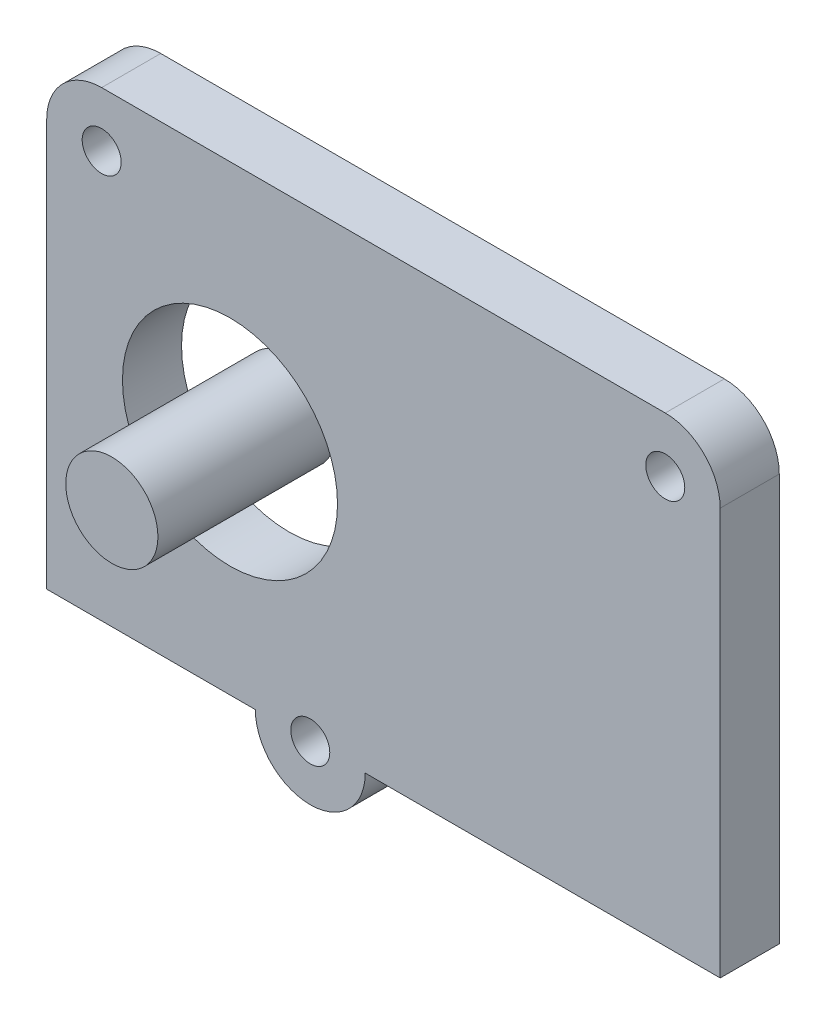
ISO-10303-21;
HEADER;
FILE_DESCRIPTION(('STEP AP214'),'2;1');
FILE_NAME('part.step','',(''),(''),'','','');
FILE_SCHEMA(('AUTOMOTIVE_DESIGN { 1 0 10303 214 1 1 1 1 }'));
ENDSEC;
DATA;
#1=APPLICATION_CONTEXT('core data for automotive mechanical design processes');
#2=APPLICATION_PROTOCOL_DEFINITION('international standard','automotive_design',2000,#1);
#3=PRODUCT_CONTEXT('',#1,'mechanical');
#4=PRODUCT('Part','Part','',(#3));
#5=PRODUCT_RELATED_PRODUCT_CATEGORY('part','',(#4));
#6=PRODUCT_DEFINITION_FORMATION('','',#4);
#7=PRODUCT_DEFINITION_CONTEXT('part definition',#1,'design');
#8=PRODUCT_DEFINITION('design','',#6,#7);
#9=PRODUCT_DEFINITION_SHAPE('','',#8);
#10=(LENGTH_UNIT() NAMED_UNIT(*) SI_UNIT(.MILLI.,.METRE.));
#11=(NAMED_UNIT(*) PLANE_ANGLE_UNIT() SI_UNIT($,.RADIAN.));
#12=(NAMED_UNIT(*) SI_UNIT($,.STERADIAN.) SOLID_ANGLE_UNIT());
#13=UNCERTAINTY_MEASURE_WITH_UNIT(LENGTH_MEASURE(1.E-05),#10,'distance_accuracy_value','');
#14=(GEOMETRIC_REPRESENTATION_CONTEXT(3) GLOBAL_UNCERTAINTY_ASSIGNED_CONTEXT((#13)) GLOBAL_UNIT_ASSIGNED_CONTEXT((#10,
#11,#12)) REPRESENTATION_CONTEXT('',''));
#15=CARTESIAN_POINT('',(0.,0.,0.));
#16=DIRECTION('',(0.,0.,1.));
#17=DIRECTION('',(1.,0.,0.));
#18=AXIS2_PLACEMENT_3D('',#15,#16,#17);
#19=CARTESIAN_POINT('',(-10.9241600633943,-4.41401369790356,15.));
#20=DIRECTION('',(0.,0.,-1.));
#21=DIRECTION('',(-1.,0.,0.));
#22=AXIS2_PLACEMENT_3D('',#19,#20,#21);
#23=CYLINDRICAL_SURFACE('',#22,3.9);
#24=CARTESIAN_POINT('',(-10.9241600633943,-4.41401369790356,15.));
#25=DIRECTION('',(0.,0.,1.));
#26=DIRECTION('',(1.,0.,0.));
#27=AXIS2_PLACEMENT_3D('',#24,#25,#26);
#28=CIRCLE('',#27,3.9);
#29=CARTESIAN_POINT('',(-7.02416006339434,-4.41401369790356,15.));
#30=VERTEX_POINT('',#29);
#31=EDGE_CURVE('E11',#30,#30,#28,.T.);
#32=ORIENTED_EDGE('',*,*,#31,.F.);
#33=EDGE_LOOP('',(#32));
#34=FACE_BOUND('',#33,.T.);
#35=CARTESIAN_POINT('',(-10.9241600633943,-4.41401369790356,0.));
#36=DIRECTION('',(0.,0.,1.));
#37=DIRECTION('',(1.,0.,0.));
#38=AXIS2_PLACEMENT_3D('',#35,#36,#37);
#39=CIRCLE('',#38,3.9);
#40=CARTESIAN_POINT('',(-7.02416006339434,-4.41401369790356,0.));
#41=VERTEX_POINT('',#40);
#42=EDGE_CURVE('E46',#41,#41,#39,.T.);
#43=ORIENTED_EDGE('',*,*,#42,.T.);
#44=EDGE_LOOP('',(#43));
#45=FACE_BOUND('',#44,.T.);
#46=ADVANCED_FACE('F43',(#34,#45),#23,.T.);
#47=CARTESIAN_POINT('',(0.,0.,15.));
#48=DIRECTION('',(0.,0.,1.));
#49=DIRECTION('',(1.,0.,0.));
#50=AXIS2_PLACEMENT_3D('',#47,#48,#49);
#51=PLANE('',#50);
#52=ORIENTED_EDGE('',*,*,#31,.T.);
#53=EDGE_LOOP('',(#52));
#54=FACE_BOUND('',#53,.T.);
#55=ADVANCED_FACE('F58',(#54),#51,.T.);
#56=CARTESIAN_POINT('',(0.,0.,0.));
#57=DIRECTION('',(0.,0.,1.));
#58=DIRECTION('',(1.,0.,0.));
#59=AXIS2_PLACEMENT_3D('',#56,#57,#58);
#60=PLANE('',#59);
#61=ORIENTED_EDGE('',*,*,#42,.F.);
#62=EDGE_LOOP('',(#61));
#63=FACE_BOUND('',#62,.T.);
#64=ADVANCED_FACE('F56',(#63),#60,.F.);
#65=CLOSED_SHELL('',(#46,#55,#64));
#66=MANIFOLD_SOLID_BREP('B2',#65);
#67=CARTESIAN_POINT('',(0.,-22.9580858177828,5.));
#68=DIRECTION('',(0.,-1.,0.));
#69=DIRECTION('',(1.,0.,0.));
#70=AXIS2_PLACEMENT_3D('',#67,#68,#69);
#71=PLANE('',#70);
#72=DIRECTION('',(-1.,0.,0.));
#73=VECTOR('',#72,1.);
#74=CARTESIAN_POINT('',(0.,-22.9580858177828,0.));
#75=LINE('',#74,#73);
#76=CARTESIAN_POINT('',(-8.7785814116003,-22.9580858177828,0.));
#77=VERTEX_POINT('',#76);
#78=CARTESIAN_POINT('',(-26.4357092941999,-22.9580858177828,0.));
#79=VERTEX_POINT('',#78);
#80=EDGE_CURVE('E194',#77,#79,#75,.T.);
#81=ORIENTED_EDGE('',*,*,#80,.F.);
#82=DIRECTION('',(0.,0.,-1.));
#83=VECTOR('',#82,1.);
#84=CARTESIAN_POINT('',(-8.7785814116003,-22.9580858177828,5.));
#85=LINE('',#84,#83);
#86=CARTESIAN_POINT('',(-8.7785814116003,-22.9580858177828,5.));
#87=VERTEX_POINT('',#86);
#88=EDGE_CURVE('E41',#87,#77,#85,.T.);
#89=ORIENTED_EDGE('',*,*,#88,.F.);
#90=DIRECTION('',(-1.,0.,0.));
#91=VECTOR('',#90,1.);
#92=CARTESIAN_POINT('',(0.,-22.9580858177828,5.));
#93=LINE('',#92,#91);
#94=CARTESIAN_POINT('',(-26.4357092941999,-22.9580858177828,5.));
#95=VERTEX_POINT('',#94);
#96=EDGE_CURVE('E238',#87,#95,#93,.T.);
#97=ORIENTED_EDGE('',*,*,#96,.T.);
#98=DIRECTION('',(0.,0.,-1.));
#99=VECTOR('',#98,1.);
#100=CARTESIAN_POINT('',(-26.4357092941999,-22.9580858177828,5.));
#101=LINE('',#100,#99);
#102=EDGE_CURVE('E136',#95,#79,#101,.T.);
#103=ORIENTED_EDGE('',*,*,#102,.T.);
#104=EDGE_LOOP('',(#81,#89,#97,#103));
#105=FACE_BOUND('',#104,.T.);
#106=ADVANCED_FACE('F84',(#105),#71,.T.);
#107=CARTESIAN_POINT('',(-4.1285814116003,-22.9580858177828,5.));
#108=DIRECTION('',(0.,0.,-1.));
#109=DIRECTION('',(-1.,0.,0.));
#110=AXIS2_PLACEMENT_3D('',#107,#108,#109);
#111=CYLINDRICAL_SURFACE('',#110,4.65);
#112=CARTESIAN_POINT('',(-4.1285814116003,-22.9580858177828,0.));
#113=DIRECTION('',(0.,0.,1.));
#114=DIRECTION('',(1.,0.,0.));
#115=AXIS2_PLACEMENT_3D('',#112,#113,#114);
#116=CIRCLE('',#115,4.65);
#117=CARTESIAN_POINT('',(0.521418588399692,-22.9580858177828,0.));
#118=VERTEX_POINT('',#117);
#119=EDGE_CURVE('E196',#77,#118,#116,.T.);
#120=ORIENTED_EDGE('',*,*,#119,.T.);
#121=DIRECTION('',(0.,0.,-1.));
#122=VECTOR('',#121,1.);
#123=CARTESIAN_POINT('',(0.521418588399692,-22.9580858177828,5.));
#124=LINE('',#123,#122);
#125=CARTESIAN_POINT('',(0.521418588399692,-22.9580858177828,5.));
#126=VERTEX_POINT('',#125);
#127=EDGE_CURVE('E93',#126,#118,#124,.T.);
#128=ORIENTED_EDGE('',*,*,#127,.F.);
#129=CARTESIAN_POINT('',(-4.1285814116003,-22.9580858177828,5.));
#130=DIRECTION('',(0.,0.,1.));
#131=DIRECTION('',(1.,0.,0.));
#132=AXIS2_PLACEMENT_3D('',#129,#130,#131);
#133=CIRCLE('',#132,4.65);
#134=EDGE_CURVE('E236',#87,#126,#133,.T.);
#135=ORIENTED_EDGE('',*,*,#134,.F.);
#136=ORIENTED_EDGE('',*,*,#88,.T.);
#137=EDGE_LOOP('',(#120,#128,#135,#136));
#138=FACE_BOUND('',#137,.T.);
#139=ADVANCED_FACE('F229',(#138),#111,.T.);
#140=CARTESIAN_POINT('',(0.,-22.9580858177828,5.));
#141=DIRECTION('',(0.,-1.,0.));
#142=DIRECTION('',(1.,0.,0.));
#143=AXIS2_PLACEMENT_3D('',#140,#141,#142);
#144=PLANE('',#143);
#145=DIRECTION('',(-1.,0.,0.));
#146=VECTOR('',#145,1.);
#147=CARTESIAN_POINT('',(0.,-22.9580858177828,0.));
#148=LINE('',#147,#146);
#149=CARTESIAN_POINT('',(30.5642907058002,-22.9580858177828,0.));
#150=VERTEX_POINT('',#149);
#151=EDGE_CURVE('E199',#150,#118,#148,.T.);
#152=ORIENTED_EDGE('',*,*,#151,.F.);
#153=DIRECTION('',(0.,0.,-1.));
#154=VECTOR('',#153,1.);
#155=CARTESIAN_POINT('',(30.5642907058002,-22.9580858177828,5.));
#156=LINE('',#155,#154);
#157=CARTESIAN_POINT('',(30.5642907058002,-22.9580858177828,5.));
#158=VERTEX_POINT('',#157);
#159=EDGE_CURVE('E219',#158,#150,#156,.T.);
#160=ORIENTED_EDGE('',*,*,#159,.F.);
#161=DIRECTION('',(-1.,0.,0.));
#162=VECTOR('',#161,1.);
#163=CARTESIAN_POINT('',(0.,-22.9580858177828,5.));
#164=LINE('',#163,#162);
#165=EDGE_CURVE('E226',#158,#126,#164,.T.);
#166=ORIENTED_EDGE('',*,*,#165,.T.);
#167=ORIENTED_EDGE('',*,*,#127,.T.);
#168=EDGE_LOOP('',(#152,#160,#166,#167));
#169=FACE_BOUND('',#168,.T.);
#170=ADVANCED_FACE('F224',(#169),#144,.T.);
#171=CARTESIAN_POINT('',(30.5642907058002,0.,5.));
#172=DIRECTION('',(-1.,0.,0.));
#173=DIRECTION('',(0.,-1.,0.));
#174=AXIS2_PLACEMENT_3D('',#171,#172,#173);
#175=PLANE('',#174);
#176=DIRECTION('',(0.,1.,0.));
#177=VECTOR('',#176,1.);
#178=CARTESIAN_POINT('',(30.5642907058002,0.,0.));
#179=LINE('',#178,#177);
#180=CARTESIAN_POINT('',(30.5642907058002,11.4790429088914,0.));
#181=VERTEX_POINT('',#180);
#182=EDGE_CURVE('E202',#150,#181,#179,.T.);
#183=ORIENTED_EDGE('',*,*,#182,.T.);
#184=DIRECTION('',(0.,0.,-1.));
#185=VECTOR('',#184,1.);
#186=CARTESIAN_POINT('',(30.5642907058002,11.4790429088914,5.));
#187=LINE('',#186,#185);
#188=CARTESIAN_POINT('',(30.5642907058002,11.4790429088914,5.));
#189=VERTEX_POINT('',#188);
#190=EDGE_CURVE('E216',#189,#181,#187,.T.);
#191=ORIENTED_EDGE('',*,*,#190,.F.);
#192=DIRECTION('',(0.,1.,0.));
#193=VECTOR('',#192,1.);
#194=CARTESIAN_POINT('',(30.5642907058002,0.,5.));
#195=LINE('',#194,#193);
#196=EDGE_CURVE('E177',#158,#189,#195,.T.);
#197=ORIENTED_EDGE('',*,*,#196,.F.);
#198=ORIENTED_EDGE('',*,*,#159,.T.);
#199=EDGE_LOOP('',(#183,#191,#197,#198));
#200=FACE_BOUND('',#199,.T.);
#201=ADVANCED_FACE('F234',(#200),#175,.F.);
#202=CARTESIAN_POINT('',(25.9142907058001,11.4790429088914,5.));
#203=DIRECTION('',(0.,0.,-1.));
#204=DIRECTION('',(-1.,0.,0.));
#205=AXIS2_PLACEMENT_3D('',#202,#203,#204);
#206=CYLINDRICAL_SURFACE('',#205,4.65000000000005);
#207=CARTESIAN_POINT('',(25.9142907058001,11.4790429088914,0.));
#208=DIRECTION('',(0.,0.,1.));
#209=DIRECTION('',(1.,0.,0.));
#210=AXIS2_PLACEMENT_3D('',#207,#208,#209);
#211=CIRCLE('',#210,4.65000000000005);
#212=CARTESIAN_POINT('',(25.9142907058001,16.1290429088914,0.));
#213=VERTEX_POINT('',#212);
#214=EDGE_CURVE('E205',#181,#213,#211,.T.);
#215=ORIENTED_EDGE('',*,*,#214,.T.);
#216=DIRECTION('',(0.,0.,-1.));
#217=VECTOR('',#216,1.);
#218=CARTESIAN_POINT('',(25.9142907058001,16.1290429088914,5.));
#219=LINE('',#218,#217);
#220=CARTESIAN_POINT('',(25.9142907058001,16.1290429088914,5.));
#221=VERTEX_POINT('',#220);
#222=EDGE_CURVE('E165',#221,#213,#219,.T.);
#223=ORIENTED_EDGE('',*,*,#222,.F.);
#224=CARTESIAN_POINT('',(25.9142907058001,11.4790429088914,5.));
#225=DIRECTION('',(0.,0.,1.));
#226=DIRECTION('',(1.,0.,0.));
#227=AXIS2_PLACEMENT_3D('',#224,#225,#226);
#228=CIRCLE('',#227,4.65000000000005);
#229=EDGE_CURVE('E174',#189,#221,#228,.T.);
#230=ORIENTED_EDGE('',*,*,#229,.F.);
#231=ORIENTED_EDGE('',*,*,#190,.T.);
#232=EDGE_LOOP('',(#215,#223,#230,#231));
#233=FACE_BOUND('',#232,.T.);
#234=ADVANCED_FACE('F312',(#233),#206,.T.);
#235=CARTESIAN_POINT('',(0.,16.1290429088914,5.));
#236=DIRECTION('',(0.,1.,0.));
#237=DIRECTION('',(-1.,0.,0.));
#238=AXIS2_PLACEMENT_3D('',#235,#236,#237);
#239=PLANE('',#238);
#240=DIRECTION('',(1.,0.,0.));
#241=VECTOR('',#240,1.);
#242=CARTESIAN_POINT('',(0.,16.1290429088914,0.));
#243=LINE('',#242,#241);
#244=CARTESIAN_POINT('',(-21.7857092941999,16.1290429088914,0.));
#245=VERTEX_POINT('',#244);
#246=EDGE_CURVE('E162',#245,#213,#243,.T.);
#247=ORIENTED_EDGE('',*,*,#246,.F.);
#248=DIRECTION('',(0.,0.,-1.));
#249=VECTOR('',#248,1.);
#250=CARTESIAN_POINT('',(-21.7857092941999,16.1290429088914,5.));
#251=LINE('',#250,#249);
#252=CARTESIAN_POINT('',(-21.7857092941999,16.1290429088914,5.));
#253=VERTEX_POINT('',#252);
#254=EDGE_CURVE('E156',#253,#245,#251,.T.);
#255=ORIENTED_EDGE('',*,*,#254,.F.);
#256=DIRECTION('',(1.,0.,0.));
#257=VECTOR('',#256,1.);
#258=CARTESIAN_POINT('',(0.,16.1290429088914,5.));
#259=LINE('',#258,#257);
#260=EDGE_CURVE('E160',#253,#221,#259,.T.);
#261=ORIENTED_EDGE('',*,*,#260,.T.);
#262=ORIENTED_EDGE('',*,*,#222,.T.);
#263=EDGE_LOOP('',(#247,#255,#261,#262));
#264=FACE_BOUND('',#263,.T.);
#265=ADVANCED_FACE('F158',(#264),#239,.T.);
#266=CARTESIAN_POINT('',(-21.7857092941999,11.4790429088914,5.));
#267=DIRECTION('',(0.,0.,-1.));
#268=DIRECTION('',(-1.,0.,0.));
#269=AXIS2_PLACEMENT_3D('',#266,#267,#268);
#270=CYLINDRICAL_SURFACE('',#269,4.65000000000005);
#271=CARTESIAN_POINT('',(-21.7857092941999,11.4790429088914,0.));
#272=DIRECTION('',(0.,0.,1.));
#273=DIRECTION('',(1.,0.,0.));
#274=AXIS2_PLACEMENT_3D('',#271,#272,#273);
#275=CIRCLE('',#274,4.65000000000005);
#276=CARTESIAN_POINT('',(-26.4357092941999,11.4790429088914,0.));
#277=VERTEX_POINT('',#276);
#278=EDGE_CURVE('E209',#245,#277,#275,.T.);
#279=ORIENTED_EDGE('',*,*,#278,.T.);
#280=DIRECTION('',(0.,0.,-1.));
#281=VECTOR('',#280,1.);
#282=CARTESIAN_POINT('',(-26.4357092941999,11.4790429088914,5.));
#283=LINE('',#282,#281);
#284=CARTESIAN_POINT('',(-26.4357092941999,11.4790429088914,5.));
#285=VERTEX_POINT('',#284);
#286=EDGE_CURVE('E166',#285,#277,#283,.T.);
#287=ORIENTED_EDGE('',*,*,#286,.F.);
#288=CARTESIAN_POINT('',(-21.7857092941999,11.4790429088914,5.));
#289=DIRECTION('',(0.,0.,1.));
#290=DIRECTION('',(1.,0.,0.));
#291=AXIS2_PLACEMENT_3D('',#288,#289,#290);
#292=CIRCLE('',#291,4.65000000000005);
#293=EDGE_CURVE('E169',#253,#285,#292,.T.);
#294=ORIENTED_EDGE('',*,*,#293,.F.);
#295=ORIENTED_EDGE('',*,*,#254,.T.);
#296=EDGE_LOOP('',(#279,#287,#294,#295));
#297=FACE_BOUND('',#296,.T.);
#298=ADVANCED_FACE('F170',(#297),#270,.T.);
#299=CARTESIAN_POINT('',(-4.1285814116003,-22.9580858177828,5.));
#300=DIRECTION('',(0.,0.,-1.));
#301=DIRECTION('',(-1.,0.,0.));
#302=AXIS2_PLACEMENT_3D('',#299,#300,#301);
#303=CYLINDRICAL_SURFACE('',#302,1.65);
#304=CARTESIAN_POINT('',(-4.1285814116003,-22.9580858177828,5.));
#305=DIRECTION('',(0.,0.,1.));
#306=DIRECTION('',(1.,0.,0.));
#307=AXIS2_PLACEMENT_3D('',#304,#305,#306);
#308=CIRCLE('',#307,1.65);
#309=CARTESIAN_POINT('',(-2.47858141160031,-22.9580858177828,5.));
#310=VERTEX_POINT('',#309);
#311=EDGE_CURVE('E242',#310,#310,#308,.T.);
#312=ORIENTED_EDGE('',*,*,#311,.T.);
#313=EDGE_LOOP('',(#312));
#314=FACE_BOUND('',#313,.T.);
#315=CARTESIAN_POINT('',(-4.1285814116003,-22.9580858177828,0.));
#316=DIRECTION('',(0.,0.,1.));
#317=DIRECTION('',(1.,0.,0.));
#318=AXIS2_PLACEMENT_3D('',#315,#316,#317);
#319=CIRCLE('',#318,1.65);
#320=CARTESIAN_POINT('',(-2.47858141160031,-22.9580858177828,0.));
#321=VERTEX_POINT('',#320);
#322=EDGE_CURVE('E191',#321,#321,#319,.T.);
#323=ORIENTED_EDGE('',*,*,#322,.F.);
#324=EDGE_LOOP('',(#323));
#325=FACE_BOUND('',#324,.T.);
#326=ADVANCED_FACE('F266',(#314,#325),#303,.F.);
#327=CARTESIAN_POINT('',(25.9142907058001,11.4790429088914,5.));
#328=DIRECTION('',(0.,0.,-1.));
#329=DIRECTION('',(-1.,0.,0.));
#330=AXIS2_PLACEMENT_3D('',#327,#328,#329);
#331=CYLINDRICAL_SURFACE('',#330,1.65000000000005);
#332=CARTESIAN_POINT('',(25.9142907058001,11.4790429088914,5.));
#333=DIRECTION('',(0.,0.,1.));
#334=DIRECTION('',(1.,0.,0.));
#335=AXIS2_PLACEMENT_3D('',#332,#333,#334);
#336=CIRCLE('',#335,1.65000000000005);
#337=CARTESIAN_POINT('',(27.5642907058002,11.4790429088914,5.));
#338=VERTEX_POINT('',#337);
#339=EDGE_CURVE('E245',#338,#338,#336,.T.);
#340=ORIENTED_EDGE('',*,*,#339,.T.);
#341=EDGE_LOOP('',(#340));
#342=FACE_BOUND('',#341,.T.);
#343=CARTESIAN_POINT('',(25.9142907058001,11.4790429088914,0.));
#344=DIRECTION('',(0.,0.,1.));
#345=DIRECTION('',(1.,0.,0.));
#346=AXIS2_PLACEMENT_3D('',#343,#344,#345);
#347=CIRCLE('',#346,1.65000000000005);
#348=CARTESIAN_POINT('',(27.5642907058002,11.4790429088914,0.));
#349=VERTEX_POINT('',#348);
#350=EDGE_CURVE('E188',#349,#349,#347,.T.);
#351=ORIENTED_EDGE('',*,*,#350,.F.);
#352=EDGE_LOOP('',(#351));
#353=FACE_BOUND('',#352,.T.);
#354=ADVANCED_FACE('F269',(#342,#353),#331,.F.);
#355=CARTESIAN_POINT('',(-21.7857092941999,11.4790429088914,5.));
#356=DIRECTION('',(0.,0.,-1.));
#357=DIRECTION('',(-1.,0.,0.));
#358=AXIS2_PLACEMENT_3D('',#355,#356,#357);
#359=CYLINDRICAL_SURFACE('',#358,1.65000000000005);
#360=CARTESIAN_POINT('',(-21.7857092941999,11.4790429088914,5.));
#361=DIRECTION('',(0.,0.,1.));
#362=DIRECTION('',(1.,0.,0.));
#363=AXIS2_PLACEMENT_3D('',#360,#361,#362);
#364=CIRCLE('',#363,1.65000000000005);
#365=CARTESIAN_POINT('',(-20.1357092941998,11.4790429088914,5.));
#366=VERTEX_POINT('',#365);
#367=EDGE_CURVE('E248',#366,#366,#364,.T.);
#368=ORIENTED_EDGE('',*,*,#367,.T.);
#369=EDGE_LOOP('',(#368));
#370=FACE_BOUND('',#369,.T.);
#371=CARTESIAN_POINT('',(-21.7857092941999,11.4790429088914,0.));
#372=DIRECTION('',(0.,0.,1.));
#373=DIRECTION('',(1.,0.,0.));
#374=AXIS2_PLACEMENT_3D('',#371,#372,#373);
#375=CIRCLE('',#374,1.65000000000005);
#376=CARTESIAN_POINT('',(-20.1357092941998,11.4790429088914,0.));
#377=VERTEX_POINT('',#376);
#378=EDGE_CURVE('E185',#377,#377,#375,.T.);
#379=ORIENTED_EDGE('',*,*,#378,.F.);
#380=EDGE_LOOP('',(#379));
#381=FACE_BOUND('',#380,.T.);
#382=ADVANCED_FACE('F289',(#370,#381),#359,.F.);
#383=CARTESIAN_POINT('',(-10.9241600633943,-4.41401369790356,5.));
#384=DIRECTION('',(0.,0.,-1.));
#385=DIRECTION('',(-1.,0.,0.));
#386=AXIS2_PLACEMENT_3D('',#383,#384,#385);
#387=CYLINDRICAL_SURFACE('',#386,9.09999999999998);
#388=CARTESIAN_POINT('',(-10.9241600633943,-4.41401369790356,5.));
#389=DIRECTION('',(0.,0.,1.));
#390=DIRECTION('',(1.,0.,0.));
#391=AXIS2_PLACEMENT_3D('',#388,#389,#390);
#392=CIRCLE('',#391,9.09999999999998);
#393=CARTESIAN_POINT('',(-1.82416006339436,-4.41401369790356,5.));
#394=VERTEX_POINT('',#393);
#395=EDGE_CURVE('E212',#394,#394,#392,.T.);
#396=ORIENTED_EDGE('',*,*,#395,.T.);
#397=EDGE_LOOP('',(#396));
#398=FACE_BOUND('',#397,.T.);
#399=CARTESIAN_POINT('',(-10.9241600633943,-4.41401369790356,0.));
#400=DIRECTION('',(0.,0.,1.));
#401=DIRECTION('',(1.,0.,0.));
#402=AXIS2_PLACEMENT_3D('',#399,#400,#401);
#403=CIRCLE('',#402,9.09999999999998);
#404=CARTESIAN_POINT('',(-1.82416006339436,-4.41401369790356,0.));
#405=VERTEX_POINT('',#404);
#406=EDGE_CURVE('E182',#405,#405,#403,.T.);
#407=ORIENTED_EDGE('',*,*,#406,.F.);
#408=EDGE_LOOP('',(#407));
#409=FACE_BOUND('',#408,.T.);
#410=ADVANCED_FACE('F86',(#398,#409),#387,.F.);
#411=CARTESIAN_POINT('',(-26.4357092941999,0.,5.));
#412=DIRECTION('',(1.,0.,0.));
#413=DIRECTION('',(0.,1.,0.));
#414=AXIS2_PLACEMENT_3D('',#411,#412,#413);
#415=PLANE('',#414);
#416=DIRECTION('',(0.,-1.,0.));
#417=VECTOR('',#416,1.);
#418=CARTESIAN_POINT('',(-26.4357092941999,0.,0.));
#419=LINE('',#418,#417);
#420=EDGE_CURVE('E129',#277,#79,#419,.T.);
#421=ORIENTED_EDGE('',*,*,#420,.T.);
#422=ORIENTED_EDGE('',*,*,#102,.F.);
#423=DIRECTION('',(0.,-1.,0.));
#424=VECTOR('',#423,1.);
#425=CARTESIAN_POINT('',(-26.4357092941999,0.,5.));
#426=LINE('',#425,#424);
#427=EDGE_CURVE('E101',#285,#95,#426,.T.);
#428=ORIENTED_EDGE('',*,*,#427,.F.);
#429=ORIENTED_EDGE('',*,*,#286,.T.);
#430=EDGE_LOOP('',(#421,#422,#428,#429));
#431=FACE_BOUND('',#430,.T.);
#432=ADVANCED_FACE('F258',(#431),#415,.F.);
#433=CARTESIAN_POINT('',(0.,0.,5.));
#434=DIRECTION('',(0.,0.,1.));
#435=DIRECTION('',(1.,0.,0.));
#436=AXIS2_PLACEMENT_3D('',#433,#434,#435);
#437=PLANE('',#436);
#438=ORIENTED_EDGE('',*,*,#395,.F.);
#439=EDGE_LOOP('',(#438));
#440=FACE_BOUND('',#439,.T.);
#441=ORIENTED_EDGE('',*,*,#367,.F.);
#442=EDGE_LOOP('',(#441));
#443=FACE_BOUND('',#442,.T.);
#444=ORIENTED_EDGE('',*,*,#339,.F.);
#445=EDGE_LOOP('',(#444));
#446=FACE_BOUND('',#445,.T.);
#447=ORIENTED_EDGE('',*,*,#311,.F.);
#448=EDGE_LOOP('',(#447));
#449=FACE_BOUND('',#448,.T.);
#450=ORIENTED_EDGE('',*,*,#96,.F.);
#451=ORIENTED_EDGE('',*,*,#134,.T.);
#452=ORIENTED_EDGE('',*,*,#165,.F.);
#453=ORIENTED_EDGE('',*,*,#196,.T.);
#454=ORIENTED_EDGE('',*,*,#229,.T.);
#455=ORIENTED_EDGE('',*,*,#260,.F.);
#456=ORIENTED_EDGE('',*,*,#293,.T.);
#457=ORIENTED_EDGE('',*,*,#427,.T.);
#458=EDGE_LOOP('',(#450,#451,#452,#453,#454,#455,#456,#457));
#459=FACE_BOUND('',#458,.T.);
#460=ADVANCED_FACE('F172',(#440,#443,#446,#449,#459),#437,.T.);
#461=CARTESIAN_POINT('',(0.,0.,0.));
#462=DIRECTION('',(0.,0.,1.));
#463=DIRECTION('',(1.,0.,0.));
#464=AXIS2_PLACEMENT_3D('',#461,#462,#463);
#465=PLANE('',#464);
#466=ORIENTED_EDGE('',*,*,#406,.T.);
#467=EDGE_LOOP('',(#466));
#468=FACE_BOUND('',#467,.T.);
#469=ORIENTED_EDGE('',*,*,#378,.T.);
#470=EDGE_LOOP('',(#469));
#471=FACE_BOUND('',#470,.T.);
#472=ORIENTED_EDGE('',*,*,#350,.T.);
#473=EDGE_LOOP('',(#472));
#474=FACE_BOUND('',#473,.T.);
#475=ORIENTED_EDGE('',*,*,#322,.T.);
#476=EDGE_LOOP('',(#475));
#477=FACE_BOUND('',#476,.T.);
#478=ORIENTED_EDGE('',*,*,#80,.T.);
#479=ORIENTED_EDGE('',*,*,#420,.F.);
#480=ORIENTED_EDGE('',*,*,#278,.F.);
#481=ORIENTED_EDGE('',*,*,#246,.T.);
#482=ORIENTED_EDGE('',*,*,#214,.F.);
#483=ORIENTED_EDGE('',*,*,#182,.F.);
#484=ORIENTED_EDGE('',*,*,#151,.T.);
#485=ORIENTED_EDGE('',*,*,#119,.F.);
#486=EDGE_LOOP('',(#478,#479,#480,#481,#482,#483,#484,#485));
#487=FACE_BOUND('',#486,.T.);
#488=ADVANCED_FACE('F231',(#468,#471,#474,#477,#487),#465,.F.);
#489=CLOSED_SHELL('',(#106,#139,#170,#201,#234,#265,#298,#326,#354,#382,#410,#432,#460,#488));
#490=MANIFOLD_SOLID_BREP('B6',#489);
#491=ADVANCED_BREP_SHAPE_REPRESENTATION('',(#18,#66,#490),#14);
#492=SHAPE_DEFINITION_REPRESENTATION(#9,#491);
ENDSEC;
END-ISO-10303-21;
